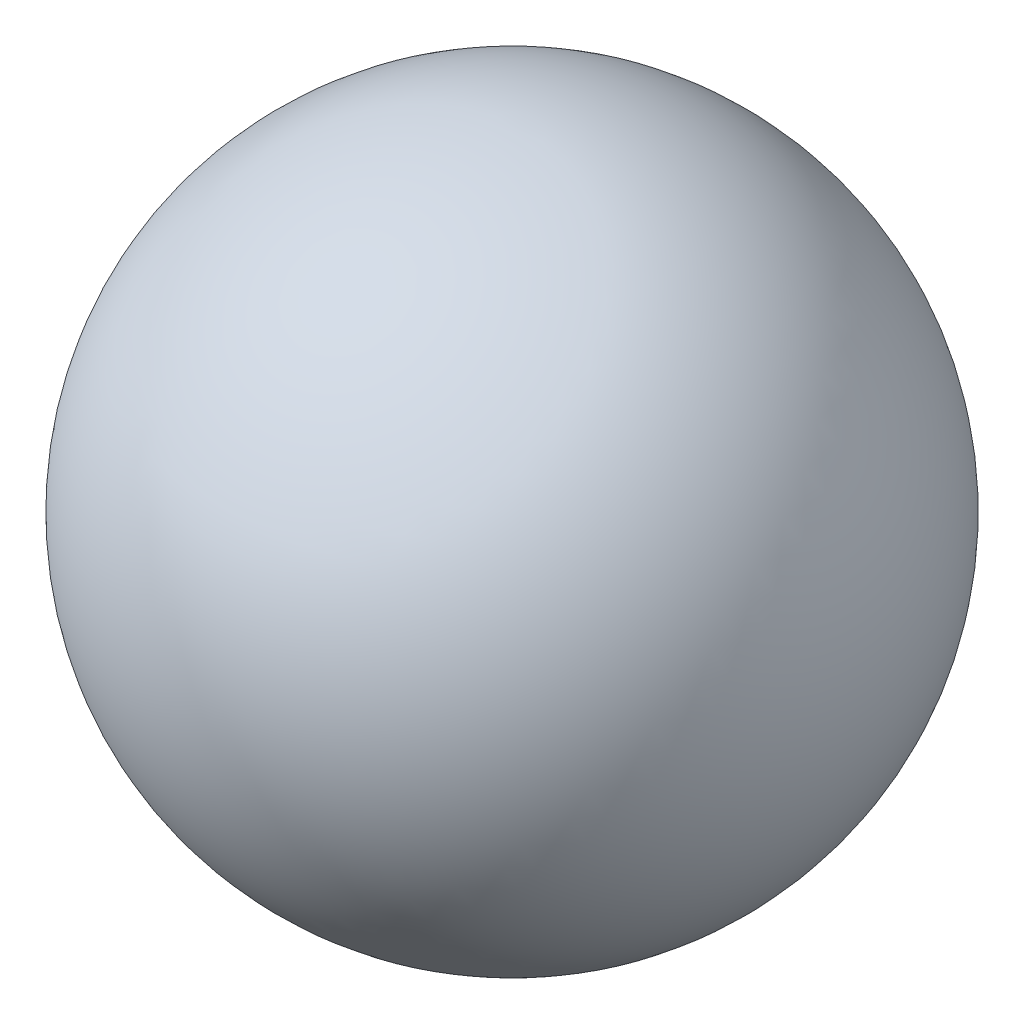
ISO-10303-21;
HEADER;
FILE_DESCRIPTION(('STEP AP214'),'2;1');
FILE_NAME('part.step','',(''),(''),'','','');
FILE_SCHEMA(('AUTOMOTIVE_DESIGN { 1 0 10303 214 1 1 1 1 }'));
ENDSEC;
DATA;
#1=APPLICATION_CONTEXT('core data for automotive mechanical design processes');
#2=APPLICATION_PROTOCOL_DEFINITION('international standard','automotive_design',2000,#1);
#3=PRODUCT_CONTEXT('',#1,'mechanical');
#4=PRODUCT('Part','Part','',(#3));
#5=PRODUCT_RELATED_PRODUCT_CATEGORY('part','',(#4));
#6=PRODUCT_DEFINITION_FORMATION('','',#4);
#7=PRODUCT_DEFINITION_CONTEXT('part definition',#1,'design');
#8=PRODUCT_DEFINITION('design','',#6,#7);
#9=PRODUCT_DEFINITION_SHAPE('','',#8);
#10=(LENGTH_UNIT() NAMED_UNIT(*) SI_UNIT(.MILLI.,.METRE.));
#11=(NAMED_UNIT(*) PLANE_ANGLE_UNIT() SI_UNIT($,.RADIAN.));
#12=(NAMED_UNIT(*) SI_UNIT($,.STERADIAN.) SOLID_ANGLE_UNIT());
#13=UNCERTAINTY_MEASURE_WITH_UNIT(LENGTH_MEASURE(1.E-05),#10,'distance_accuracy_value','');
#14=(GEOMETRIC_REPRESENTATION_CONTEXT(3) GLOBAL_UNCERTAINTY_ASSIGNED_CONTEXT((#13)) GLOBAL_UNIT_ASSIGNED_CONTEXT((#10,
#11,#12)) REPRESENTATION_CONTEXT('',''));
#15=CARTESIAN_POINT('',(0.,0.,0.));
#16=DIRECTION('',(0.,0.,1.));
#17=DIRECTION('',(1.,0.,0.));
#18=AXIS2_PLACEMENT_3D('',#15,#16,#17);
#19=CARTESIAN_POINT('',(73.75,0.,0.));
#20=DIRECTION('',(0.,1.,0.));
#21=DIRECTION('',(1.,0.,0.));
#22=AXIS2_PLACEMENT_3D('',#19,#20,#21);
#23=SPHERICAL_SURFACE('',#22,17.5);
#24=CARTESIAN_POINT('',(73.75,17.5,0.));
#25=VERTEX_POINT('',#24);
#26=VERTEX_LOOP('',#25);
#27=FACE_BOUND('',#26,.T.);
#28=ADVANCED_FACE('F30',(#27),#23,.T.);
#29=CLOSED_SHELL('',(#28));
#30=MANIFOLD_SOLID_BREP('B2',#29);
#31=ADVANCED_BREP_SHAPE_REPRESENTATION('',(#18,#30),#14);
#32=SHAPE_DEFINITION_REPRESENTATION(#9,#31);
ENDSEC;
END-ISO-10303-21;
